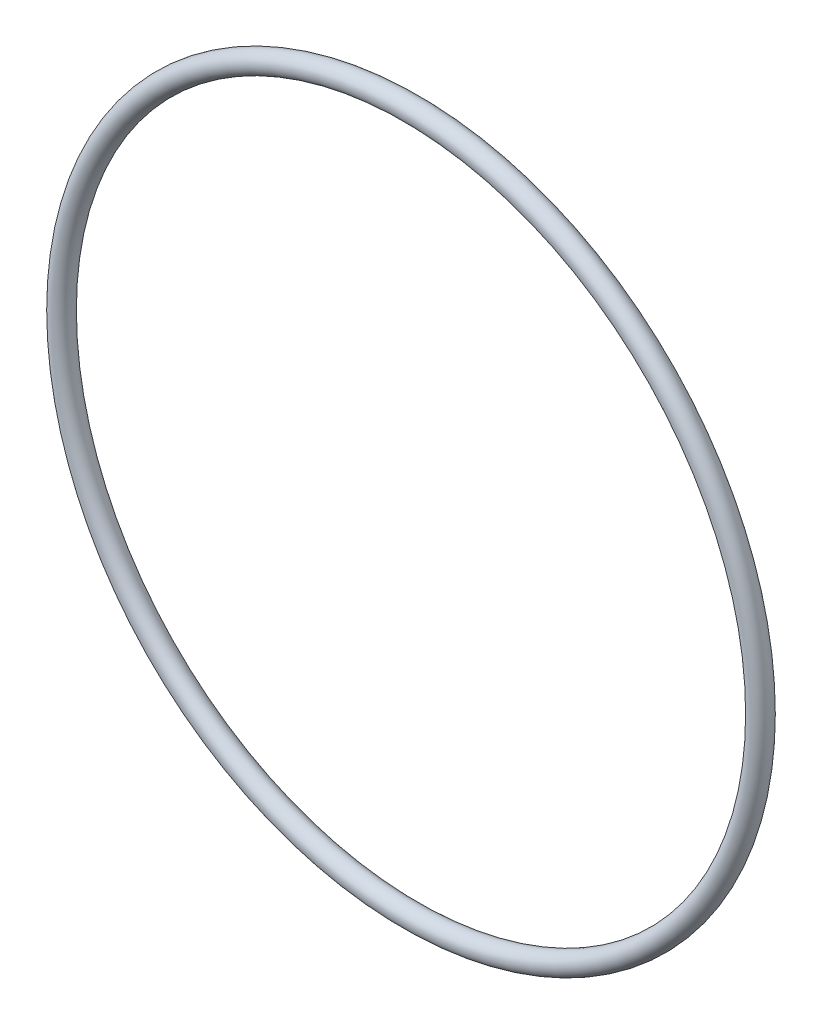
ISO-10303-21;
HEADER;
FILE_DESCRIPTION(('STEP AP214'),'2;1');
FILE_NAME('part.step','',(''),(''),'','','');
FILE_SCHEMA(('AUTOMOTIVE_DESIGN { 1 0 10303 214 1 1 1 1 }'));
ENDSEC;
DATA;
#1=APPLICATION_CONTEXT('core data for automotive mechanical design processes');
#2=APPLICATION_PROTOCOL_DEFINITION('international standard','automotive_design',2000,#1);
#3=PRODUCT_CONTEXT('',#1,'mechanical');
#4=PRODUCT('Part','Part','',(#3));
#5=PRODUCT_RELATED_PRODUCT_CATEGORY('part','',(#4));
#6=PRODUCT_DEFINITION_FORMATION('','',#4);
#7=PRODUCT_DEFINITION_CONTEXT('part definition',#1,'design');
#8=PRODUCT_DEFINITION('design','',#6,#7);
#9=PRODUCT_DEFINITION_SHAPE('','',#8);
#10=(LENGTH_UNIT() NAMED_UNIT(*) SI_UNIT(.MILLI.,.METRE.));
#11=(NAMED_UNIT(*) PLANE_ANGLE_UNIT() SI_UNIT($,.RADIAN.));
#12=(NAMED_UNIT(*) SI_UNIT($,.STERADIAN.) SOLID_ANGLE_UNIT());
#13=UNCERTAINTY_MEASURE_WITH_UNIT(LENGTH_MEASURE(1.E-05),#10,'distance_accuracy_value','');
#14=(GEOMETRIC_REPRESENTATION_CONTEXT(3) GLOBAL_UNCERTAINTY_ASSIGNED_CONTEXT((#13)) GLOBAL_UNIT_ASSIGNED_CONTEXT((#10,
#11,#12)) REPRESENTATION_CONTEXT('',''));
#15=CARTESIAN_POINT('',(0.,0.,0.));
#16=DIRECTION('',(0.,0.,1.));
#17=DIRECTION('',(1.,0.,0.));
#18=AXIS2_PLACEMENT_3D('',#15,#16,#17);
#19=CARTESIAN_POINT('',(0.,0.,0.));
#20=DIRECTION('',(0.,0.,1.));
#21=DIRECTION('',(1.,0.,0.));
#22=AXIS2_PLACEMENT_3D('',#19,#20,#21);
#23=TOROIDAL_SURFACE('',#22,58.7121,1.76530000000001);
#24=CARTESIAN_POINT('',(60.4774,0.,0.));
#25=VERTEX_POINT('',#24);
#26=VERTEX_LOOP('',#25);
#27=FACE_BOUND('',#26,.T.);
#28=ADVANCED_FACE('F33',(#27),#23,.T.);
#29=CLOSED_SHELL('',(#28));
#30=MANIFOLD_SOLID_BREP('B2',#29);
#31=ADVANCED_BREP_SHAPE_REPRESENTATION('',(#18,#30),#14);
#32=SHAPE_DEFINITION_REPRESENTATION(#9,#31);
ENDSEC;
END-ISO-10303-21;
